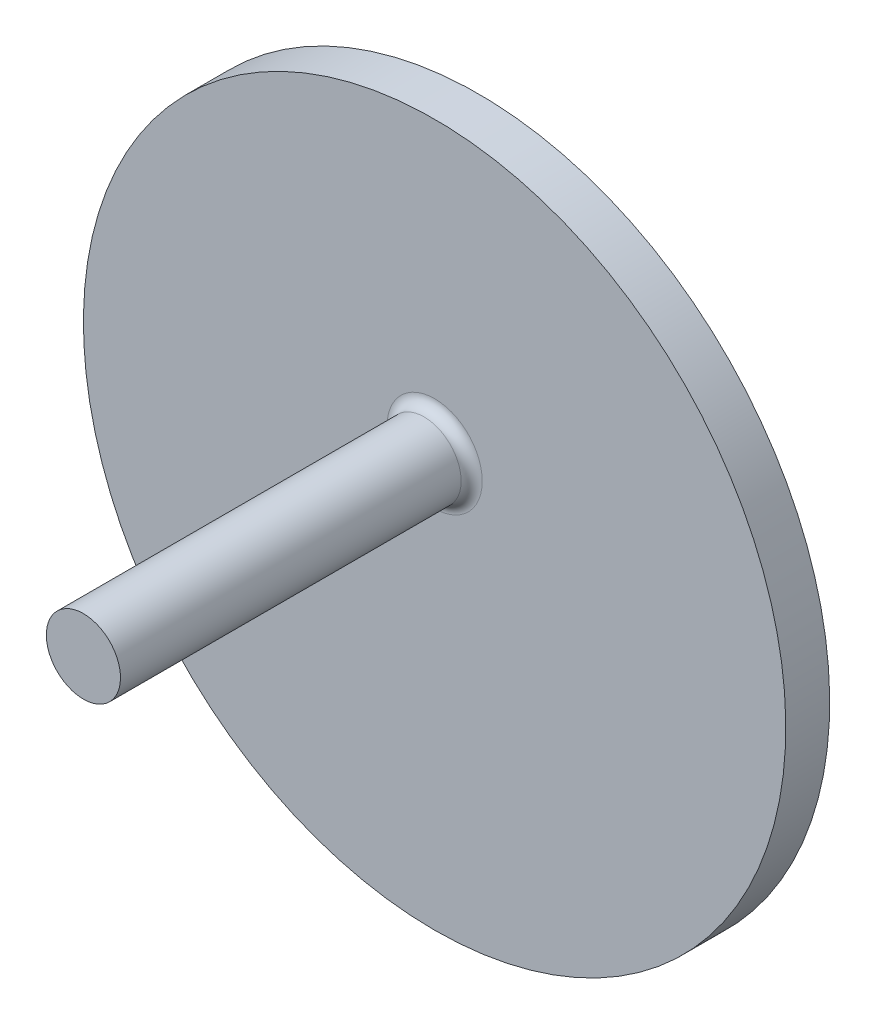
ISO-10303-21;
HEADER;
FILE_DESCRIPTION(('STEP AP214'),'2;1');
FILE_NAME('part.step','',(''),(''),'','','');
FILE_SCHEMA(('AUTOMOTIVE_DESIGN { 1 0 10303 214 1 1 1 1 }'));
ENDSEC;
DATA;
#1=APPLICATION_CONTEXT('core data for automotive mechanical design processes');
#2=APPLICATION_PROTOCOL_DEFINITION('international standard','automotive_design',2000,#1);
#3=PRODUCT_CONTEXT('',#1,'mechanical');
#4=PRODUCT('Part','Part','',(#3));
#5=PRODUCT_RELATED_PRODUCT_CATEGORY('part','',(#4));
#6=PRODUCT_DEFINITION_FORMATION('','',#4);
#7=PRODUCT_DEFINITION_CONTEXT('part definition',#1,'design');
#8=PRODUCT_DEFINITION('design','',#6,#7);
#9=PRODUCT_DEFINITION_SHAPE('','',#8);
#10=(LENGTH_UNIT() NAMED_UNIT(*) SI_UNIT(.MILLI.,.METRE.));
#11=(NAMED_UNIT(*) PLANE_ANGLE_UNIT() SI_UNIT($,.RADIAN.));
#12=(NAMED_UNIT(*) SI_UNIT($,.STERADIAN.) SOLID_ANGLE_UNIT());
#13=UNCERTAINTY_MEASURE_WITH_UNIT(LENGTH_MEASURE(1.E-05),#10,'distance_accuracy_value','');
#14=(GEOMETRIC_REPRESENTATION_CONTEXT(3) GLOBAL_UNCERTAINTY_ASSIGNED_CONTEXT((#13)) GLOBAL_UNIT_ASSIGNED_CONTEXT((#10,
#11,#12)) REPRESENTATION_CONTEXT('',''));
#15=CARTESIAN_POINT('',(0.,0.,0.));
#16=DIRECTION('',(0.,0.,1.));
#17=DIRECTION('',(1.,0.,0.));
#18=AXIS2_PLACEMENT_3D('',#15,#16,#17);
#19=CARTESIAN_POINT('',(6.34999999999982,117.343550312249,53.9750000000001));
#20=DIRECTION('',(0.,0.,1.));
#21=DIRECTION('',(0.,-1.,0.));
#22=AXIS2_PLACEMENT_3D('',#19,#20,#21);
#23=PLANE('',#22);
#24=CARTESIAN_POINT('',(6.34999999999982,117.343550312249,53.9750000000001));
#25=DIRECTION('',(0.,0.,-1.));
#26=DIRECTION('',(0.,1.,0.));
#27=AXIS2_PLACEMENT_3D('',#24,#25,#26);
#28=CIRCLE('',#27,5.36311563643211);
#29=CARTESIAN_POINT('',(6.34999999999982,122.706665948681,53.9750000000001));
#30=VERTEX_POINT('',#29);
#31=EDGE_CURVE('E18',#30,#30,#28,.T.);
#32=ORIENTED_EDGE('',*,*,#31,.F.);
#33=EDGE_LOOP('',(#32));
#34=FACE_BOUND('',#33,.T.);
#35=ADVANCED_FACE('F15',(#34),#23,.T.);
#36=CARTESIAN_POINT('',(6.34999999999982,117.343550312249,53.9750000000001));
#37=DIRECTION('',(0.,0.,-1.));
#38=DIRECTION('',(0.,1.,0.));
#39=AXIS2_PLACEMENT_3D('',#36,#37,#38);
#40=CYLINDRICAL_SURFACE('',#39,5.36311563643211);
#41=CARTESIAN_POINT('',(6.34999999999982,117.343550312249,4.6990000000001));
#42=DIRECTION('',(0.,0.,-1.));
#43=DIRECTION('',(0.,1.,0.));
#44=AXIS2_PLACEMENT_3D('',#41,#42,#43);
#45=CIRCLE('',#44,5.36311563643212);
#46=CARTESIAN_POINT('',(6.34999999999982,122.706665948681,4.6990000000001));
#47=VERTEX_POINT('',#46);
#48=EDGE_CURVE('E29',#47,#47,#45,.T.);
#49=ORIENTED_EDGE('',*,*,#48,.F.);
#50=EDGE_LOOP('',(#49));
#51=FACE_BOUND('',#50,.T.);
#52=ORIENTED_EDGE('',*,*,#31,.T.);
#53=EDGE_LOOP('',(#52));
#54=FACE_BOUND('',#53,.T.);
#55=ADVANCED_FACE('F48',(#51,#54),#40,.T.);
#56=CARTESIAN_POINT('',(6.34999999999982,117.343550312249,4.6990000000001));
#57=DIRECTION('',(0.,0.,-1.));
#58=DIRECTION('',(0.,1.,0.));
#59=AXIS2_PLACEMENT_3D('',#56,#57,#58);
#60=TOROIDAL_SURFACE('',#59,6.88711563643211,1.524);
#61=CARTESIAN_POINT('',(6.34999999999982,117.343550312249,3.1750000000001));
#62=DIRECTION('',(0.,0.,1.));
#63=DIRECTION('',(1.,0.,0.));
#64=AXIS2_PLACEMENT_3D('',#61,#62,#63);
#65=CIRCLE('',#64,6.88711563643209);
#66=CARTESIAN_POINT('',(13.2371156364319,117.343550312249,3.1750000000001));
#67=VERTEX_POINT('',#66);
#68=EDGE_CURVE('E27',#67,#67,#65,.F.);
#69=ORIENTED_EDGE('',*,*,#68,.F.);
#70=EDGE_LOOP('',(#69));
#71=FACE_BOUND('',#70,.T.);
#72=ORIENTED_EDGE('',*,*,#48,.T.);
#73=EDGE_LOOP('',(#72));
#74=FACE_BOUND('',#73,.T.);
#75=ADVANCED_FACE('F38',(#71,#74),#60,.F.);
#76=CARTESIAN_POINT('',(6.34999999999991,108.440377699871,3.17500000000009));
#77=DIRECTION('',(0.,0.,1.));
#78=DIRECTION('',(0.,-1.,0.));
#79=AXIS2_PLACEMENT_3D('',#76,#77,#78);
#80=PLANE('',#79);
#81=ORIENTED_EDGE('',*,*,#68,.T.);
#82=EDGE_LOOP('',(#81));
#83=FACE_BOUND('',#82,.T.);
#84=CARTESIAN_POINT('',(6.34999999999991,108.440377699871,3.17500000000009));
#85=DIRECTION('',(0.,0.,1.));
#86=DIRECTION('',(0.,-1.,0.));
#87=AXIS2_PLACEMENT_3D('',#84,#85,#86);
#88=CIRCLE('',#87,50.8);
#89=CARTESIAN_POINT('',(6.34999999999991,57.6403776998712,3.17500000000006));
#90=VERTEX_POINT('',#89);
#91=EDGE_CURVE('E22',#90,#90,#88,.F.);
#92=ORIENTED_EDGE('',*,*,#91,.F.);
#93=EDGE_LOOP('',(#92));
#94=FACE_BOUND('',#93,.T.);
#95=ADVANCED_FACE('F47',(#83,#94),#80,.T.);
#96=CARTESIAN_POINT('',(6.34999999999991,108.440377699871,0.));
#97=DIRECTION('',(0.,0.,1.));
#98=DIRECTION('',(0.,-1.,0.));
#99=AXIS2_PLACEMENT_3D('',#96,#97,#98);
#100=CYLINDRICAL_SURFACE('',#99,50.8);
#101=CARTESIAN_POINT('',(6.34999999999991,108.440377699871,-3.17499999999991));
#102=DIRECTION('',(0.,0.,1.));
#103=DIRECTION('',(0.,-1.,0.));
#104=AXIS2_PLACEMENT_3D('',#101,#102,#103);
#105=CIRCLE('',#104,50.8);
#106=CARTESIAN_POINT('',(6.34999999999991,57.6403776998712,-3.17499999999994));
#107=VERTEX_POINT('',#106);
#108=EDGE_CURVE('E10',#107,#107,#105,.T.);
#109=ORIENTED_EDGE('',*,*,#108,.T.);
#110=EDGE_LOOP('',(#109));
#111=FACE_BOUND('',#110,.T.);
#112=ORIENTED_EDGE('',*,*,#91,.T.);
#113=EDGE_LOOP('',(#112));
#114=FACE_BOUND('',#113,.T.);
#115=ADVANCED_FACE('F79',(#111,#114),#100,.T.);
#116=CARTESIAN_POINT('',(6.34999999999991,108.440377699871,-3.17499999999991));
#117=DIRECTION('',(0.,0.,1.));
#118=DIRECTION('',(0.,-1.,0.));
#119=AXIS2_PLACEMENT_3D('',#116,#117,#118);
#120=PLANE('',#119);
#121=ORIENTED_EDGE('',*,*,#108,.F.);
#122=EDGE_LOOP('',(#121));
#123=FACE_BOUND('',#122,.T.);
#124=ADVANCED_FACE('F77',(#123),#120,.F.);
#125=CLOSED_SHELL('',(#35,#55,#75,#95,#115,#124));
#126=MANIFOLD_SOLID_BREP('B1',#125);
#127=ADVANCED_BREP_SHAPE_REPRESENTATION('',(#18,#126),#14);
#128=SHAPE_DEFINITION_REPRESENTATION(#9,#127);
ENDSEC;
END-ISO-10303-21;
